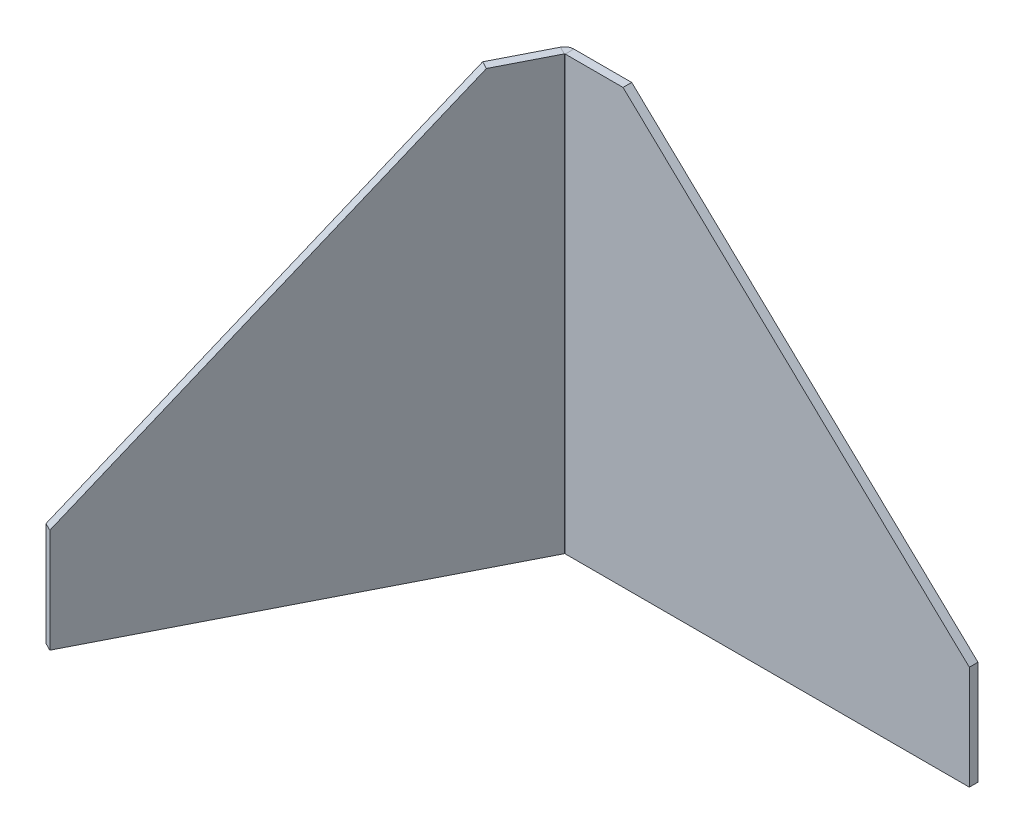
ISO-10303-21;
HEADER;
FILE_DESCRIPTION(('STEP AP214'),'2;1');
FILE_NAME('part.step','',(''),(''),'','','');
FILE_SCHEMA(('AUTOMOTIVE_DESIGN { 1 0 10303 214 1 1 1 1 }'));
ENDSEC;
DATA;
#1=APPLICATION_CONTEXT('core data for automotive mechanical design processes');
#2=APPLICATION_PROTOCOL_DEFINITION('international standard','automotive_design',2000,#1);
#3=PRODUCT_CONTEXT('',#1,'mechanical');
#4=PRODUCT('Part','Part','',(#3));
#5=PRODUCT_RELATED_PRODUCT_CATEGORY('part','',(#4));
#6=PRODUCT_DEFINITION_FORMATION('','',#4);
#7=PRODUCT_DEFINITION_CONTEXT('part definition',#1,'design');
#8=PRODUCT_DEFINITION('design','',#6,#7);
#9=PRODUCT_DEFINITION_SHAPE('','',#8);
#10=(LENGTH_UNIT() NAMED_UNIT(*) SI_UNIT(.MILLI.,.METRE.));
#11=(NAMED_UNIT(*) PLANE_ANGLE_UNIT() SI_UNIT($,.RADIAN.));
#12=(NAMED_UNIT(*) SI_UNIT($,.STERADIAN.) SOLID_ANGLE_UNIT());
#13=UNCERTAINTY_MEASURE_WITH_UNIT(LENGTH_MEASURE(1.E-05),#10,'distance_accuracy_value','');
#14=(GEOMETRIC_REPRESENTATION_CONTEXT(3) GLOBAL_UNCERTAINTY_ASSIGNED_CONTEXT((#13)) GLOBAL_UNIT_ASSIGNED_CONTEXT((#10,
#11,#12)) REPRESENTATION_CONTEXT('',''));
#15=CARTESIAN_POINT('',(0.,0.,0.));
#16=DIRECTION('',(0.,0.,1.));
#17=DIRECTION('',(1.,0.,0.));
#18=AXIS2_PLACEMENT_3D('',#15,#16,#17);
#19=CARTESIAN_POINT('',(-136223.841413214,134227.128561915,55.4226319468683));
#20=DIRECTION('',(0.,1.,0.));
#21=DIRECTION('',(0.891006524188369,0.,0.453990499739545));
#22=AXIS2_PLACEMENT_3D('',#19,#20,#21);
#23=PLANE('',#22);
#24=DIRECTION('',(-0.453990499739545,0.,0.891006524188369));
#25=VECTOR('',#24,1.);
#26=CARTESIAN_POINT('',(-136214.931347972,134227.128561915,59.9625369442691));
#27=LINE('',#26,#25);
#28=CARTESIAN_POINT('',(-136184.583835727,134227.128561915,0.402190597895924));
#29=VERTEX_POINT('',#28);
#30=CARTESIAN_POINT('',(-136214.931347972,134227.128561915,59.9625369442691));
#31=VERTEX_POINT('',#30);
#32=EDGE_CURVE('E65',#29,#31,#27,.T.);
#33=ORIENTED_EDGE('',*,*,#32,.F.);
#34=DIRECTION('',(-0.891006524188369,0.,-0.453990499739545));
#35=VECTOR('',#34,1.);
#36=CARTESIAN_POINT('',(-136193.493900969,134227.128561915,-4.13771439950494));
#37=LINE('',#36,#35);
#38=CARTESIAN_POINT('',(-136193.493900969,134227.128561915,-4.13771439953169));
#39=VERTEX_POINT('',#38);
#40=EDGE_CURVE('E118',#29,#39,#37,.T.);
#41=ORIENTED_EDGE('',*,*,#40,.T.);
#42=DIRECTION('',(-0.453990499739545,0.,0.891006524188369));
#43=VECTOR('',#42,1.);
#44=CARTESIAN_POINT('',(-136223.841413214,134227.128561915,55.4226319468683));
#45=LINE('',#44,#43);
#46=CARTESIAN_POINT('',(-136223.841413214,134227.128561915,55.4226319468683));
#47=VERTEX_POINT('',#46);
#48=EDGE_CURVE('E45',#39,#47,#45,.T.);
#49=ORIENTED_EDGE('',*,*,#48,.T.);
#50=DIRECTION('',(0.891006524188369,0.,0.453990499739545));
#51=VECTOR('',#50,1.);
#52=CARTESIAN_POINT('',(-136223.841413214,134227.128561915,55.4226319468683));
#53=LINE('',#52,#51);
#54=EDGE_CURVE('E146',#47,#31,#53,.T.);
#55=ORIENTED_EDGE('',*,*,#54,.T.);
#56=EDGE_LOOP('',(#33,#41,#49,#55));
#57=FACE_BOUND('',#56,.T.);
#58=ADVANCED_FACE('F41',(#57),#23,.T.);
#59=CARTESIAN_POINT('',(-136394.087850616,133727.128561915,389.550078517516));
#60=DIRECTION('',(0.,-1.,0.));
#61=DIRECTION('',(-0.891006524188369,0.,-0.453990499739545));
#62=AXIS2_PLACEMENT_3D('',#59,#60,#61);
#63=PLANE('',#62);
#64=DIRECTION('',(0.453990499739545,0.,-0.891006524188369));
#65=VECTOR('',#64,1.);
#66=CARTESIAN_POINT('',(-136394.087850616,133727.128561915,389.550078517516));
#67=LINE('',#66,#65);
#68=CARTESIAN_POINT('',(-136394.087850616,133727.128561915,389.550078517516));
#69=VERTEX_POINT('',#68);
#70=CARTESIAN_POINT('',(-136193.493900969,133727.128561915,-4.13771439950494));
#71=VERTEX_POINT('',#70);
#72=EDGE_CURVE('E137',#69,#71,#67,.T.);
#73=ORIENTED_EDGE('',*,*,#72,.T.);
#74=DIRECTION('',(0.891006524188369,0.,0.453990499739545));
#75=VECTOR('',#74,1.);
#76=CARTESIAN_POINT('',(-136193.493900969,133727.128561915,-4.13771439950494));
#77=LINE('',#76,#75);
#78=CARTESIAN_POINT('',(-136184.583835727,133727.128561915,0.402190597895924));
#79=VERTEX_POINT('',#78);
#80=EDGE_CURVE('E12',#71,#79,#77,.T.);
#81=ORIENTED_EDGE('',*,*,#80,.T.);
#82=DIRECTION('',(0.453990499739545,0.,-0.891006524188369));
#83=VECTOR('',#82,1.);
#84=CARTESIAN_POINT('',(-136385.177785374,133727.128561915,394.089983514917));
#85=LINE('',#84,#83);
#86=CARTESIAN_POINT('',(-136385.177785374,133727.128561915,394.089983514917));
#87=VERTEX_POINT('',#86);
#88=EDGE_CURVE('E58',#87,#79,#85,.T.);
#89=ORIENTED_EDGE('',*,*,#88,.F.);
#90=DIRECTION('',(0.891006524188369,0.,0.453990499739545));
#91=VECTOR('',#90,1.);
#92=CARTESIAN_POINT('',(-136394.087850616,133727.128561915,389.550078517516));
#93=LINE('',#92,#91);
#94=EDGE_CURVE('E207',#69,#87,#93,.T.);
#95=ORIENTED_EDGE('',*,*,#94,.F.);
#96=EDGE_LOOP('',(#73,#81,#89,#95));
#97=FACE_BOUND('',#96,.T.);
#98=ADVANCED_FACE('F43',(#97),#63,.T.);
#99=CARTESIAN_POINT('',(-74355.5108788075,0.,-121345.985940298));
#100=DIRECTION('',(0.891006524188369,0.,0.453990499739545));
#101=DIRECTION('',(0.453990499739545,0.,-0.891006524188369));
#102=AXIS2_PLACEMENT_3D('',#99,#100,#101);
#103=PLANE('',#102);
#104=ORIENTED_EDGE('',*,*,#88,.T.);
#105=DIRECTION('',(0.,1.,0.));
#106=VECTOR('',#105,1.);
#107=CARTESIAN_POINT('',(-136184.583835727,0.,0.402190597895924));
#108=LINE('',#107,#106);
#109=EDGE_CURVE('E50',#79,#29,#108,.T.);
#110=ORIENTED_EDGE('',*,*,#109,.T.);
#111=ORIENTED_EDGE('',*,*,#32,.T.);
#112=DIRECTION('',(-0.318886809529834,-0.711773999328797,0.625850602450276));
#113=VECTOR('',#112,1.);
#114=CARTESIAN_POINT('',(-136385.177785374,133847.128561915,394.089983514917));
#115=LINE('',#114,#113);
#116=CARTESIAN_POINT('',(-136385.177785374,133847.128561915,394.089983514917));
#117=VERTEX_POINT('',#116);
#118=EDGE_CURVE('E167',#31,#117,#115,.T.);
#119=ORIENTED_EDGE('',*,*,#118,.T.);
#120=DIRECTION('',(0.,-1.,0.));
#121=VECTOR('',#120,1.);
#122=CARTESIAN_POINT('',(-136385.177785374,133727.128561915,394.089983514917));
#123=LINE('',#122,#121);
#124=EDGE_CURVE('E204',#117,#87,#123,.T.);
#125=ORIENTED_EDGE('',*,*,#124,.T.);
#126=EDGE_LOOP('',(#104,#110,#111,#119,#125));
#127=FACE_BOUND('',#126,.T.);
#128=ADVANCED_FACE('F212',(#127),#103,.T.);
#129=CARTESIAN_POINT('',(-136394.087850616,133847.128561915,389.550078517516));
#130=DIRECTION('',(-0.323138633656895,0.702408551969216,0.634195277149605));
#131=DIRECTION('',(-0.318886809529834,-0.711773999328797,0.625850602450276));
#132=AXIS2_PLACEMENT_3D('',#129,#130,#131);
#133=PLANE('',#132);
#134=ORIENTED_EDGE('',*,*,#118,.F.);
#135=ORIENTED_EDGE('',*,*,#54,.F.);
#136=DIRECTION('',(-0.318886809529834,-0.711773999328797,0.625850602450276));
#137=VECTOR('',#136,1.);
#138=CARTESIAN_POINT('',(-136394.087850616,133847.128561915,389.550078517516));
#139=LINE('',#138,#137);
#140=CARTESIAN_POINT('',(-136394.087850616,133847.128561915,389.550078517516));
#141=VERTEX_POINT('',#140);
#142=EDGE_CURVE('E135',#47,#141,#139,.T.);
#143=ORIENTED_EDGE('',*,*,#142,.T.);
#144=DIRECTION('',(0.891006524188369,0.,0.453990499739545));
#145=VECTOR('',#144,1.);
#146=CARTESIAN_POINT('',(-136394.087850616,133847.128561915,389.550078517516));
#147=LINE('',#146,#145);
#148=EDGE_CURVE('E136',#141,#117,#147,.T.);
#149=ORIENTED_EDGE('',*,*,#148,.T.);
#150=EDGE_LOOP('',(#134,#135,#143,#149));
#151=FACE_BOUND('',#150,.T.);
#152=ADVANCED_FACE('F216',(#151),#133,.T.);
#153=CARTESIAN_POINT('',(-136394.087850616,133727.128561915,389.550078517516));
#154=DIRECTION('',(-0.453990499739545,0.,0.891006524188369));
#155=DIRECTION('',(0.891006524188369,0.,0.453990499739545));
#156=AXIS2_PLACEMENT_3D('',#153,#154,#155);
#157=PLANE('',#156);
#158=ORIENTED_EDGE('',*,*,#124,.F.);
#159=ORIENTED_EDGE('',*,*,#148,.F.);
#160=DIRECTION('',(0.,-1.,0.));
#161=VECTOR('',#160,1.);
#162=CARTESIAN_POINT('',(-136394.087850616,133727.128561915,389.550078517516));
#163=LINE('',#162,#161);
#164=EDGE_CURVE('E199',#141,#69,#163,.T.);
#165=ORIENTED_EDGE('',*,*,#164,.T.);
#166=ORIENTED_EDGE('',*,*,#94,.T.);
#167=EDGE_LOOP('',(#158,#159,#165,#166));
#168=FACE_BOUND('',#167,.T.);
#169=ADVANCED_FACE('F219',(#168),#157,.T.);
#170=CARTESIAN_POINT('',(-74364.4209440493,0.,-121350.525845296));
#171=DIRECTION('',(0.891006524188369,0.,0.453990499739545));
#172=DIRECTION('',(0.453990499739545,0.,-0.891006524188369));
#173=AXIS2_PLACEMENT_3D('',#170,#171,#172);
#174=PLANE('',#173);
#175=DIRECTION('',(0.,1.,0.));
#176=VECTOR('',#175,1.);
#177=CARTESIAN_POINT('',(-136193.493900969,0.,-4.13771439950494));
#178=LINE('',#177,#176);
#179=EDGE_CURVE('E125',#71,#39,#178,.T.);
#180=ORIENTED_EDGE('',*,*,#179,.F.);
#181=ORIENTED_EDGE('',*,*,#72,.F.);
#182=ORIENTED_EDGE('',*,*,#164,.F.);
#183=ORIENTED_EDGE('',*,*,#142,.F.);
#184=ORIENTED_EDGE('',*,*,#48,.F.);
#185=EDGE_LOOP('',(#180,#181,#182,#183,#184));
#186=FACE_BOUND('',#185,.T.);
#187=ADVANCED_FACE('F130',(#186),#174,.F.);
#188=CARTESIAN_POINT('',(-135717.081380895,133727.128561915,-10.));
#189=DIRECTION('',(1.,0.,0.));
#190=DIRECTION('',(0.,0.,-1.));
#191=AXIS2_PLACEMENT_3D('',#188,#189,#190);
#192=PLANE('',#191);
#193=DIRECTION('',(0.,1.,0.));
#194=VECTOR('',#193,1.);
#195=CARTESIAN_POINT('',(-135717.081380895,133727.128561915,0.));
#196=LINE('',#195,#194);
#197=CARTESIAN_POINT('',(-135717.081380895,133727.128561915,0.));
#198=VERTEX_POINT('',#197);
#199=CARTESIAN_POINT('',(-135717.081380895,133847.128561915,0.));
#200=VERTEX_POINT('',#199);
#201=EDGE_CURVE('E175',#198,#200,#196,.T.);
#202=ORIENTED_EDGE('',*,*,#201,.F.);
#203=DIRECTION('',(0.,0.,1.));
#204=VECTOR('',#203,1.);
#205=CARTESIAN_POINT('',(-135717.081380895,133727.128561915,-10.));
#206=LINE('',#205,#204);
#207=CARTESIAN_POINT('',(-135717.081380895,133727.128561915,-10.));
#208=VERTEX_POINT('',#207);
#209=EDGE_CURVE('E164',#208,#198,#206,.T.);
#210=ORIENTED_EDGE('',*,*,#209,.F.);
#211=DIRECTION('',(0.,1.,0.));
#212=VECTOR('',#211,1.);
#213=CARTESIAN_POINT('',(-135717.081380895,133727.128561915,-10.));
#214=LINE('',#213,#212);
#215=CARTESIAN_POINT('',(-135717.081380895,133847.128561915,-10.));
#216=VERTEX_POINT('',#215);
#217=EDGE_CURVE('E192',#208,#216,#214,.T.);
#218=ORIENTED_EDGE('',*,*,#217,.T.);
#219=DIRECTION('',(0.,0.,1.));
#220=VECTOR('',#219,1.);
#221=CARTESIAN_POINT('',(-135717.081380895,133847.128561915,-10.));
#222=LINE('',#221,#220);
#223=EDGE_CURVE('E190',#216,#200,#222,.T.);
#224=ORIENTED_EDGE('',*,*,#223,.T.);
#225=EDGE_LOOP('',(#202,#210,#218,#224));
#226=FACE_BOUND('',#225,.T.);
#227=ADVANCED_FACE('F245',(#226),#192,.T.);
#228=CARTESIAN_POINT('',(-135717.081380895,133847.128561915,-10.));
#229=DIRECTION('',(0.688749461914709,0.724999433594398,0.));
#230=DIRECTION('',(-0.724999433594398,0.688749461914709,0.));
#231=AXIS2_PLACEMENT_3D('',#228,#229,#230);
#232=PLANE('',#231);
#233=DIRECTION('',(-0.724999433594398,0.688749461914709,0.));
#234=VECTOR('',#233,1.);
#235=CARTESIAN_POINT('',(-135717.081380895,133847.128561915,0.));
#236=LINE('',#235,#234);
#237=CARTESIAN_POINT('',(-136117.081380895,134227.128561915,0.));
#238=VERTEX_POINT('',#237);
#239=EDGE_CURVE('E172',#200,#238,#236,.T.);
#240=ORIENTED_EDGE('',*,*,#239,.F.);
#241=ORIENTED_EDGE('',*,*,#223,.F.);
#242=DIRECTION('',(-0.724999433594398,0.688749461914709,0.));
#243=VECTOR('',#242,1.);
#244=CARTESIAN_POINT('',(-135717.081380895,133847.128561915,-10.));
#245=LINE('',#244,#243);
#246=CARTESIAN_POINT('',(-136117.081380895,134227.128561915,-10.));
#247=VERTEX_POINT('',#246);
#248=EDGE_CURVE('E187',#216,#247,#245,.T.);
#249=ORIENTED_EDGE('',*,*,#248,.T.);
#250=DIRECTION('',(0.,0.,1.));
#251=VECTOR('',#250,1.);
#252=CARTESIAN_POINT('',(-136117.081380895,134227.128561915,-10.));
#253=LINE('',#252,#251);
#254=EDGE_CURVE('E185',#247,#238,#253,.T.);
#255=ORIENTED_EDGE('',*,*,#254,.T.);
#256=EDGE_LOOP('',(#240,#241,#249,#255));
#257=FACE_BOUND('',#256,.T.);
#258=ADVANCED_FACE('F247',(#257),#232,.T.);
#259=CARTESIAN_POINT('',(0.,0.,-10.));
#260=DIRECTION('',(0.,0.,1.));
#261=DIRECTION('',(1.,0.,0.));
#262=AXIS2_PLACEMENT_3D('',#259,#260,#261);
#263=PLANE('',#262);
#264=DIRECTION('',(1.,0.,0.));
#265=VECTOR('',#264,1.);
#266=CARTESIAN_POINT('',(-136632.081380895,133727.128561915,-10.));
#267=LINE('',#266,#265);
#268=CARTESIAN_POINT('',(-136183.927520322,133727.128561915,-10.));
#269=VERTEX_POINT('',#268);
#270=EDGE_CURVE('E168',#269,#208,#267,.T.);
#271=ORIENTED_EDGE('',*,*,#270,.F.);
#272=DIRECTION('',(0.,1.,0.));
#273=VECTOR('',#272,1.);
#274=CARTESIAN_POINT('',(-136183.927520322,0.,-10.));
#275=LINE('',#274,#273);
#276=CARTESIAN_POINT('',(-136183.927520322,134227.128561915,-9.99999999999891));
#277=VERTEX_POINT('',#276);
#278=EDGE_CURVE('E182',#269,#277,#275,.T.);
#279=ORIENTED_EDGE('',*,*,#278,.T.);
#280=DIRECTION('',(-1.,0.,0.));
#281=VECTOR('',#280,1.);
#282=CARTESIAN_POINT('',(-136257.081380895,134227.128561915,-10.));
#283=LINE('',#282,#281);
#284=EDGE_CURVE('E180',#247,#277,#283,.T.);
#285=ORIENTED_EDGE('',*,*,#284,.F.);
#286=ORIENTED_EDGE('',*,*,#248,.F.);
#287=ORIENTED_EDGE('',*,*,#217,.F.);
#288=EDGE_LOOP('',(#271,#279,#285,#286,#287));
#289=FACE_BOUND('',#288,.T.);
#290=ADVANCED_FACE('F242',(#289),#263,.F.);
#291=CARTESIAN_POINT('',(-136257.081380895,134227.128561915,-10.));
#292=DIRECTION('',(0.,1.,0.));
#293=DIRECTION('',(0.,0.,1.));
#294=AXIS2_PLACEMENT_3D('',#291,#292,#293);
#295=PLANE('',#294);
#296=DIRECTION('',(0.,0.,-1.));
#297=VECTOR('',#296,1.);
#298=CARTESIAN_POINT('',(-136183.927520322,134227.128561915,-10.));
#299=LINE('',#298,#297);
#300=CARTESIAN_POINT('',(-136183.927520322,134227.128561915,0.));
#301=VERTEX_POINT('',#300);
#302=EDGE_CURVE('E151',#301,#277,#299,.T.);
#303=ORIENTED_EDGE('',*,*,#302,.F.);
#304=DIRECTION('',(-1.,0.,0.));
#305=VECTOR('',#304,1.);
#306=CARTESIAN_POINT('',(-136257.081380895,134227.128561915,0.));
#307=LINE('',#306,#305);
#308=EDGE_CURVE('E170',#238,#301,#307,.T.);
#309=ORIENTED_EDGE('',*,*,#308,.F.);
#310=ORIENTED_EDGE('',*,*,#254,.F.);
#311=ORIENTED_EDGE('',*,*,#284,.T.);
#312=EDGE_LOOP('',(#303,#309,#310,#311));
#313=FACE_BOUND('',#312,.T.);
#314=ADVANCED_FACE('F238',(#313),#295,.T.);
#315=CARTESIAN_POINT('',(0.,0.,0.));
#316=DIRECTION('',(0.,0.,1.));
#317=DIRECTION('',(1.,0.,0.));
#318=AXIS2_PLACEMENT_3D('',#315,#316,#317);
#319=PLANE('',#318);
#320=DIRECTION('',(0.,1.,0.));
#321=VECTOR('',#320,1.);
#322=CARTESIAN_POINT('',(-136183.927520322,0.,0.));
#323=LINE('',#322,#321);
#324=CARTESIAN_POINT('',(-136183.927520322,133727.128561915,0.));
#325=VERTEX_POINT('',#324);
#326=EDGE_CURVE('E155',#325,#301,#323,.T.);
#327=ORIENTED_EDGE('',*,*,#326,.F.);
#328=DIRECTION('',(1.,0.,0.));
#329=VECTOR('',#328,1.);
#330=CARTESIAN_POINT('',(-136632.081380895,133727.128561915,0.));
#331=LINE('',#330,#329);
#332=EDGE_CURVE('E178',#325,#198,#331,.T.);
#333=ORIENTED_EDGE('',*,*,#332,.T.);
#334=ORIENTED_EDGE('',*,*,#201,.T.);
#335=ORIENTED_EDGE('',*,*,#239,.T.);
#336=ORIENTED_EDGE('',*,*,#308,.T.);
#337=EDGE_LOOP('',(#327,#333,#334,#335,#336));
#338=FACE_BOUND('',#337,.T.);
#339=ADVANCED_FACE('F234',(#338),#319,.T.);
#340=CARTESIAN_POINT('',(-136632.081380895,133727.128561915,-10.));
#341=DIRECTION('',(0.,-1.,0.));
#342=DIRECTION('',(0.,0.,-1.));
#343=AXIS2_PLACEMENT_3D('',#340,#341,#342);
#344=PLANE('',#343);
#345=DIRECTION('',(0.,0.,1.));
#346=VECTOR('',#345,1.);
#347=CARTESIAN_POINT('',(-136183.927520322,133727.128561915,-10.));
#348=LINE('',#347,#346);
#349=EDGE_CURVE('E152',#269,#325,#348,.T.);
#350=ORIENTED_EDGE('',*,*,#349,.F.);
#351=ORIENTED_EDGE('',*,*,#270,.T.);
#352=ORIENTED_EDGE('',*,*,#209,.T.);
#353=ORIENTED_EDGE('',*,*,#332,.F.);
#354=EDGE_LOOP('',(#350,#351,#352,#353));
#355=FACE_BOUND('',#354,.T.);
#356=ADVANCED_FACE('F229',(#355),#344,.T.);
#357=CARTESIAN_POINT('',(-136183.927520322,133727.128561915,0.7366));
#358=DIRECTION('',(0.,-1.,0.));
#359=DIRECTION('',(0.,0.,-1.));
#360=AXIS2_PLACEMENT_3D('',#357,#358,#359);
#361=PLANE('',#360);
#362=ORIENTED_EDGE('',*,*,#349,.T.);
#363=CARTESIAN_POINT('',(-136183.927520322,133727.128561915,0.7366));
#364=DIRECTION('',(0.,1.,0.));
#365=DIRECTION('',(0.,0.,1.));
#366=AXIS2_PLACEMENT_3D('',#363,#364,#365);
#367=CIRCLE('',#366,0.7366);
#368=EDGE_CURVE('E161',#325,#79,#367,.T.);
#369=ORIENTED_EDGE('',*,*,#368,.T.);
#370=ORIENTED_EDGE('',*,*,#80,.F.);
#371=CARTESIAN_POINT('',(-136183.927520322,133727.128561915,0.7366));
#372=DIRECTION('',(0.,1.,0.));
#373=DIRECTION('',(0.,0.,-1.));
#374=AXIS2_PLACEMENT_3D('',#371,#372,#373);
#375=CIRCLE('',#374,10.7365999999989);
#376=EDGE_CURVE('E145',#269,#71,#375,.T.);
#377=ORIENTED_EDGE('',*,*,#376,.F.);
#378=EDGE_LOOP('',(#362,#369,#370,#377));
#379=FACE_BOUND('',#378,.T.);
#380=ADVANCED_FACE('F226',(#379),#361,.T.);
#381=CARTESIAN_POINT('',(-136183.927520322,134227.128561915,0.7366));
#382=DIRECTION('',(0.,1.,0.));
#383=DIRECTION('',(0.,0.,1.));
#384=AXIS2_PLACEMENT_3D('',#381,#382,#383);
#385=PLANE('',#384);
#386=ORIENTED_EDGE('',*,*,#40,.F.);
#387=CARTESIAN_POINT('',(-136183.927520322,134227.128561915,0.7366));
#388=DIRECTION('',(0.,1.,0.));
#389=DIRECTION('',(0.,0.,1.));
#390=AXIS2_PLACEMENT_3D('',#387,#388,#389);
#391=CIRCLE('',#390,0.7366);
#392=EDGE_CURVE('E157',#29,#301,#391,.F.);
#393=ORIENTED_EDGE('',*,*,#392,.T.);
#394=ORIENTED_EDGE('',*,*,#302,.T.);
#395=CARTESIAN_POINT('',(-136183.927520322,134227.128561915,0.7366));
#396=DIRECTION('',(0.,-1.,0.));
#397=DIRECTION('',(0.,0.,1.));
#398=AXIS2_PLACEMENT_3D('',#395,#396,#397);
#399=CIRCLE('',#398,10.7365999999989);
#400=EDGE_CURVE('E143',#39,#277,#399,.T.);
#401=ORIENTED_EDGE('',*,*,#400,.F.);
#402=EDGE_LOOP('',(#386,#393,#394,#401));
#403=FACE_BOUND('',#402,.T.);
#404=ADVANCED_FACE('F149',(#403),#385,.T.);
#405=CARTESIAN_POINT('',(-136183.927520322,133476.988794104,0.7366));
#406=DIRECTION('',(0.,1.,0.));
#407=DIRECTION('',(0.,0.,1.));
#408=AXIS2_PLACEMENT_3D('',#405,#406,#407);
#409=CYLINDRICAL_SURFACE('',#408,10.7366);
#410=ORIENTED_EDGE('',*,*,#400,.T.);
#411=ORIENTED_EDGE('',*,*,#278,.F.);
#412=ORIENTED_EDGE('',*,*,#376,.T.);
#413=ORIENTED_EDGE('',*,*,#179,.T.);
#414=EDGE_LOOP('',(#410,#411,#412,#413));
#415=FACE_BOUND('',#414,.T.);
#416=ADVANCED_FACE('F141',(#415),#409,.T.);
#417=CARTESIAN_POINT('',(-136183.927520322,133476.988794104,0.7366));
#418=DIRECTION('',(0.,1.,0.));
#419=DIRECTION('',(0.,0.,1.));
#420=AXIS2_PLACEMENT_3D('',#417,#418,#419);
#421=CYLINDRICAL_SURFACE('',#420,0.7366);
#422=ORIENTED_EDGE('',*,*,#392,.F.);
#423=ORIENTED_EDGE('',*,*,#109,.F.);
#424=ORIENTED_EDGE('',*,*,#368,.F.);
#425=ORIENTED_EDGE('',*,*,#326,.T.);
#426=EDGE_LOOP('',(#422,#423,#424,#425));
#427=FACE_BOUND('',#426,.T.);
#428=ADVANCED_FACE('F225',(#427),#421,.F.);
#429=CLOSED_SHELL('',(#58,#98,#128,#152,#169,#187,#227,#258,#290,#314,#339,#356,#380,#404,#416,#428));
#430=MANIFOLD_SOLID_BREP('B2',#429);
#431=ADVANCED_BREP_SHAPE_REPRESENTATION('',(#18,#430),#14);
#432=SHAPE_DEFINITION_REPRESENTATION(#9,#431);
ENDSEC;
END-ISO-10303-21;
